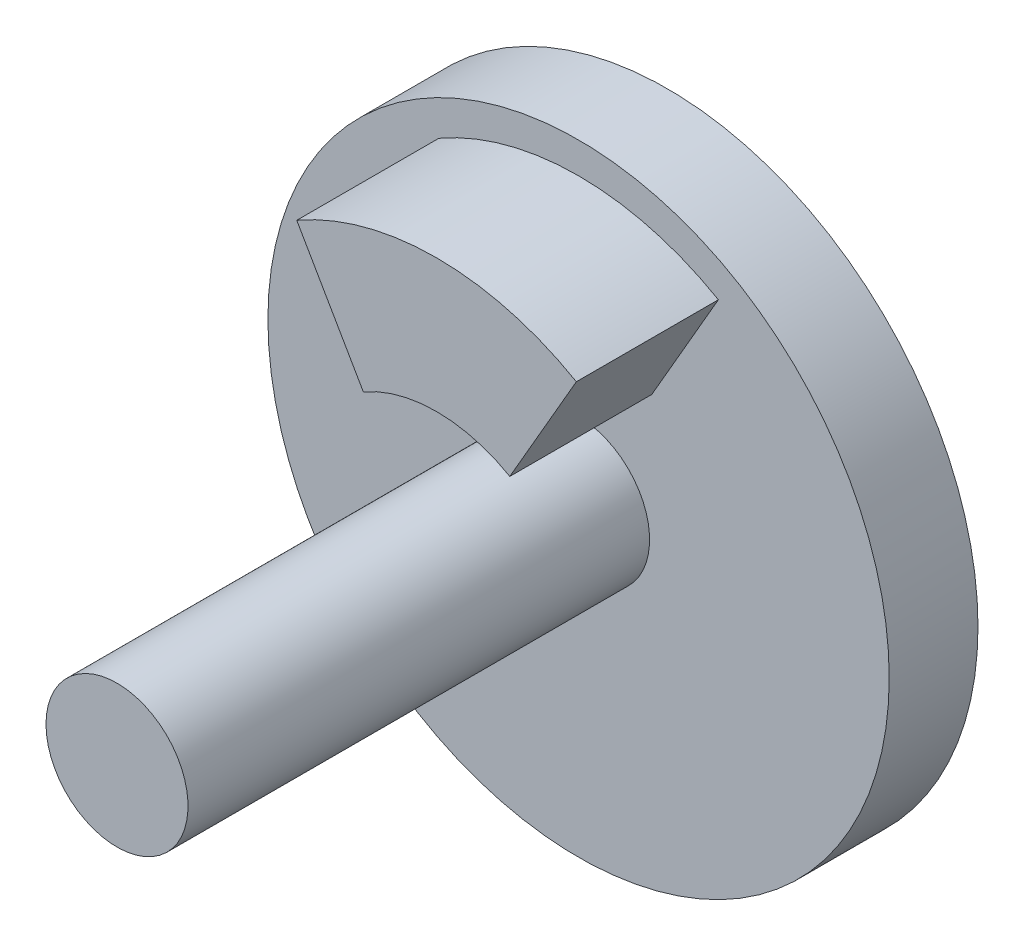
ISO-10303-21;
HEADER;
FILE_DESCRIPTION(('STEP AP214'),'2;1');
FILE_NAME('part.step','',(''),(''),'','','');
FILE_SCHEMA(('AUTOMOTIVE_DESIGN { 1 0 10303 214 1 1 1 1 }'));
ENDSEC;
DATA;
#1=APPLICATION_CONTEXT('core data for automotive mechanical design processes');
#2=APPLICATION_PROTOCOL_DEFINITION('international standard','automotive_design',2000,#1);
#3=PRODUCT_CONTEXT('',#1,'mechanical');
#4=PRODUCT('Part','Part','',(#3));
#5=PRODUCT_RELATED_PRODUCT_CATEGORY('part','',(#4));
#6=PRODUCT_DEFINITION_FORMATION('','',#4);
#7=PRODUCT_DEFINITION_CONTEXT('part definition',#1,'design');
#8=PRODUCT_DEFINITION('design','',#6,#7);
#9=PRODUCT_DEFINITION_SHAPE('','',#8);
#10=(LENGTH_UNIT() NAMED_UNIT(*) SI_UNIT(.MILLI.,.METRE.));
#11=(NAMED_UNIT(*) PLANE_ANGLE_UNIT() SI_UNIT($,.RADIAN.));
#12=(NAMED_UNIT(*) SI_UNIT($,.STERADIAN.) SOLID_ANGLE_UNIT());
#13=UNCERTAINTY_MEASURE_WITH_UNIT(LENGTH_MEASURE(1.E-05),#10,'distance_accuracy_value','');
#14=(GEOMETRIC_REPRESENTATION_CONTEXT(3) GLOBAL_UNCERTAINTY_ASSIGNED_CONTEXT((#13)) GLOBAL_UNIT_ASSIGNED_CONTEXT((#10,
#11,#12)) REPRESENTATION_CONTEXT('',''));
#15=CARTESIAN_POINT('',(0.,0.,0.));
#16=DIRECTION('',(0.,0.,1.));
#17=DIRECTION('',(1.,0.,0.));
#18=AXIS2_PLACEMENT_3D('',#15,#16,#17);
#19=CARTESIAN_POINT('',(0.,0.,2.5));
#20=DIRECTION('',(0.,0.,1.));
#21=DIRECTION('',(1.,0.,0.));
#22=AXIS2_PLACEMENT_3D('',#19,#20,#21);
#23=PLANE('',#22);
#24=CARTESIAN_POINT('',(0.,0.,2.5));
#25=DIRECTION('',(0.,0.,1.));
#26=DIRECTION('',(1.,0.,0.));
#27=AXIS2_PLACEMENT_3D('',#24,#25,#26);
#28=CIRCLE('',#27,4.);
#29=CARTESIAN_POINT('',(-4.,0.,2.5));
#30=VERTEX_POINT('',#29);
#31=EDGE_CURVE('E107',#30,#30,#28,.T.);
#32=ORIENTED_EDGE('',*,*,#31,.F.);
#33=EDGE_LOOP('',(#32));
#34=FACE_BOUND('',#33,.T.);
#35=CARTESIAN_POINT('',(0.,0.,2.5));
#36=DIRECTION('',(0.,0.,1.));
#37=DIRECTION('',(1.,0.,0.));
#38=AXIS2_PLACEMENT_3D('',#35,#36,#37);
#39=CIRCLE('',#38,17.5);
#40=CARTESIAN_POINT('',(17.5,0.,2.5));
#41=VERTEX_POINT('',#40);
#42=EDGE_CURVE('E11',#41,#41,#39,.T.);
#43=ORIENTED_EDGE('',*,*,#42,.T.);
#44=EDGE_LOOP('',(#43));
#45=FACE_BOUND('',#44,.T.);
#46=DIRECTION('',(0.499999999999996,-0.866025403784441,0.));
#47=VECTOR('',#46,1.);
#48=CARTESIAN_POINT('',(-4.12499999999996,7.14470958122165,2.5));
#49=LINE('',#48,#47);
#50=CARTESIAN_POINT('',(-7.87499999999993,13.639900109605,2.5));
#51=VERTEX_POINT('',#50);
#52=CARTESIAN_POINT('',(-4.12499999999996,7.14470958122165,2.5));
#53=VERTEX_POINT('',#52);
#54=EDGE_CURVE('E128',#51,#53,#49,.T.);
#55=ORIENTED_EDGE('',*,*,#54,.F.);
#56=CARTESIAN_POINT('',(0.,0.,2.5));
#57=DIRECTION('',(0.,0.,1.));
#58=DIRECTION('',(-1.,0.,0.));
#59=AXIS2_PLACEMENT_3D('',#56,#57,#58);
#60=CIRCLE('',#59,15.75);
#61=CARTESIAN_POINT('',(7.87499999999993,13.639900109605,2.5));
#62=VERTEX_POINT('',#61);
#63=EDGE_CURVE('E112',#62,#51,#60,.T.);
#64=ORIENTED_EDGE('',*,*,#63,.F.);
#65=DIRECTION('',(0.499999999999995,0.866025403784441,0.));
#66=VECTOR('',#65,1.);
#67=CARTESIAN_POINT('',(7.87499999999993,13.639900109605,2.5));
#68=LINE('',#67,#66);
#69=CARTESIAN_POINT('',(4.12499999999996,7.14470958122164,2.5));
#70=VERTEX_POINT('',#69);
#71=EDGE_CURVE('E119',#70,#62,#68,.T.);
#72=ORIENTED_EDGE('',*,*,#71,.F.);
#73=CARTESIAN_POINT('',(0.,0.,2.5));
#74=DIRECTION('',(0.,0.,-1.));
#75=DIRECTION('',(1.,0.,0.));
#76=AXIS2_PLACEMENT_3D('',#73,#74,#75);
#77=CIRCLE('',#76,8.25);
#78=EDGE_CURVE('E130',#53,#70,#77,.T.);
#79=ORIENTED_EDGE('',*,*,#78,.F.);
#80=EDGE_LOOP('',(#55,#64,#72,#79));
#81=FACE_BOUND('',#80,.T.);
#82=ADVANCED_FACE('F34',(#34,#45,#81),#23,.T.);
#83=CARTESIAN_POINT('',(0.,0.,2.5));
#84=DIRECTION('',(0.,0.,-1.));
#85=DIRECTION('',(-1.,0.,0.));
#86=AXIS2_PLACEMENT_3D('',#83,#84,#85);
#87=CYLINDRICAL_SURFACE('',#86,17.5);
#88=ORIENTED_EDGE('',*,*,#42,.F.);
#89=EDGE_LOOP('',(#88));
#90=FACE_BOUND('',#89,.T.);
#91=CARTESIAN_POINT('',(0.,0.,-2.5));
#92=DIRECTION('',(0.,0.,1.));
#93=DIRECTION('',(1.,0.,0.));
#94=AXIS2_PLACEMENT_3D('',#91,#92,#93);
#95=CIRCLE('',#94,17.5);
#96=CARTESIAN_POINT('',(17.5,0.,-2.5));
#97=VERTEX_POINT('',#96);
#98=EDGE_CURVE('E38',#97,#97,#95,.T.);
#99=ORIENTED_EDGE('',*,*,#98,.T.);
#100=EDGE_LOOP('',(#99));
#101=FACE_BOUND('',#100,.T.);
#102=ADVANCED_FACE('F36',(#90,#101),#87,.T.);
#103=CARTESIAN_POINT('',(0.,0.,-2.5));
#104=DIRECTION('',(0.,0.,1.));
#105=DIRECTION('',(1.,0.,0.));
#106=AXIS2_PLACEMENT_3D('',#103,#104,#105);
#107=PLANE('',#106);
#108=DIRECTION('',(1.,0.,0.));
#109=VECTOR('',#108,1.);
#110=CARTESIAN_POINT('',(2.38513917599978,2.2,-2.5));
#111=LINE('',#110,#109);
#112=CARTESIAN_POINT('',(-2.38513917599978,2.2,-2.5));
#113=VERTEX_POINT('',#112);
#114=CARTESIAN_POINT('',(2.38513917599978,2.2,-2.5));
#115=VERTEX_POINT('',#114);
#116=EDGE_CURVE('E100',#113,#115,#111,.T.);
#117=ORIENTED_EDGE('',*,*,#116,.F.);
#118=CARTESIAN_POINT('',(0.,0.,-2.5));
#119=DIRECTION('',(0.,0.,-1.));
#120=DIRECTION('',(-1.,0.,0.));
#121=AXIS2_PLACEMENT_3D('',#118,#119,#120);
#122=CIRCLE('',#121,3.24482493963679);
#123=EDGE_CURVE('E49',#115,#113,#122,.T.);
#124=ORIENTED_EDGE('',*,*,#123,.F.);
#125=EDGE_LOOP('',(#117,#124));
#126=FACE_BOUND('',#125,.T.);
#127=ORIENTED_EDGE('',*,*,#98,.F.);
#128=EDGE_LOOP('',(#127));
#129=FACE_BOUND('',#128,.T.);
#130=ADVANCED_FACE('F146',(#126,#129),#107,.F.);
#131=CARTESIAN_POINT('',(0.,0.,10.5));
#132=DIRECTION('',(0.,0.,-1.));
#133=DIRECTION('',(-1.,0.,0.));
#134=AXIS2_PLACEMENT_3D('',#131,#132,#133);
#135=CYLINDRICAL_SURFACE('',#134,15.75);
#136=ORIENTED_EDGE('',*,*,#63,.T.);
#137=DIRECTION('',(0.,0.,-1.));
#138=VECTOR('',#137,1.);
#139=CARTESIAN_POINT('',(-7.87499999999993,13.639900109605,10.5));
#140=LINE('',#139,#138);
#141=CARTESIAN_POINT('',(-7.87499999999993,13.639900109605,10.5));
#142=VERTEX_POINT('',#141);
#143=EDGE_CURVE('E139',#142,#51,#140,.T.);
#144=ORIENTED_EDGE('',*,*,#143,.F.);
#145=CARTESIAN_POINT('',(0.,0.,10.5));
#146=DIRECTION('',(0.,0.,1.));
#147=DIRECTION('',(-1.,0.,0.));
#148=AXIS2_PLACEMENT_3D('',#145,#146,#147);
#149=CIRCLE('',#148,15.75);
#150=CARTESIAN_POINT('',(7.87499999999993,13.639900109605,10.5));
#151=VERTEX_POINT('',#150);
#152=EDGE_CURVE('E115',#151,#142,#149,.T.);
#153=ORIENTED_EDGE('',*,*,#152,.F.);
#154=DIRECTION('',(0.,0.,-1.));
#155=VECTOR('',#154,1.);
#156=CARTESIAN_POINT('',(7.87499999999993,13.639900109605,10.5));
#157=LINE('',#156,#155);
#158=EDGE_CURVE('E125',#151,#62,#157,.T.);
#159=ORIENTED_EDGE('',*,*,#158,.T.);
#160=EDGE_LOOP('',(#136,#144,#153,#159));
#161=FACE_BOUND('',#160,.T.);
#162=ADVANCED_FACE('F148',(#161),#135,.T.);
#163=CARTESIAN_POINT('',(-4.12499999999996,7.14470958122165,10.5));
#164=DIRECTION('',(0.866025403784441,0.499999999999996,0.));
#165=DIRECTION('',(-0.499999999999996,0.866025403784441,0.));
#166=AXIS2_PLACEMENT_3D('',#163,#164,#165);
#167=PLANE('',#166);
#168=ORIENTED_EDGE('',*,*,#54,.T.);
#169=DIRECTION('',(0.,0.,-1.));
#170=VECTOR('',#169,1.);
#171=CARTESIAN_POINT('',(-4.12499999999996,7.14470958122165,10.5));
#172=LINE('',#171,#170);
#173=CARTESIAN_POINT('',(-4.12499999999996,7.14470958122165,10.5));
#174=VERTEX_POINT('',#173);
#175=EDGE_CURVE('E136',#174,#53,#172,.T.);
#176=ORIENTED_EDGE('',*,*,#175,.F.);
#177=DIRECTION('',(0.499999999999996,-0.866025403784441,0.));
#178=VECTOR('',#177,1.);
#179=CARTESIAN_POINT('',(-4.12499999999996,7.14470958122165,10.5));
#180=LINE('',#179,#178);
#181=EDGE_CURVE('E118',#142,#174,#180,.T.);
#182=ORIENTED_EDGE('',*,*,#181,.F.);
#183=ORIENTED_EDGE('',*,*,#143,.T.);
#184=EDGE_LOOP('',(#168,#176,#182,#183));
#185=FACE_BOUND('',#184,.T.);
#186=ADVANCED_FACE('F154',(#185),#167,.F.);
#187=CARTESIAN_POINT('',(0.,0.,10.5));
#188=DIRECTION('',(0.,0.,-1.));
#189=DIRECTION('',(-1.,0.,0.));
#190=AXIS2_PLACEMENT_3D('',#187,#188,#189);
#191=CYLINDRICAL_SURFACE('',#190,8.25);
#192=ORIENTED_EDGE('',*,*,#78,.T.);
#193=DIRECTION('',(0.,0.,-1.));
#194=VECTOR('',#193,1.);
#195=CARTESIAN_POINT('',(4.12499999999996,7.14470958122164,10.5));
#196=LINE('',#195,#194);
#197=CARTESIAN_POINT('',(4.12499999999996,7.14470958122164,10.5));
#198=VERTEX_POINT('',#197);
#199=EDGE_CURVE('E57',#198,#70,#196,.T.);
#200=ORIENTED_EDGE('',*,*,#199,.F.);
#201=CARTESIAN_POINT('',(0.,0.,10.5));
#202=DIRECTION('',(0.,0.,-1.));
#203=DIRECTION('',(1.,0.,0.));
#204=AXIS2_PLACEMENT_3D('',#201,#202,#203);
#205=CIRCLE('',#204,8.25);
#206=EDGE_CURVE('E121',#174,#198,#205,.T.);
#207=ORIENTED_EDGE('',*,*,#206,.F.);
#208=ORIENTED_EDGE('',*,*,#175,.T.);
#209=EDGE_LOOP('',(#192,#200,#207,#208));
#210=FACE_BOUND('',#209,.T.);
#211=ADVANCED_FACE('F168',(#210),#191,.F.);
#212=CARTESIAN_POINT('',(7.87499999999993,13.639900109605,10.5));
#213=DIRECTION('',(-0.866025403784441,0.499999999999995,0.));
#214=DIRECTION('',(-0.499999999999995,-0.866025403784441,0.));
#215=AXIS2_PLACEMENT_3D('',#212,#213,#214);
#216=PLANE('',#215);
#217=ORIENTED_EDGE('',*,*,#71,.T.);
#218=ORIENTED_EDGE('',*,*,#158,.F.);
#219=DIRECTION('',(0.499999999999995,0.866025403784441,0.));
#220=VECTOR('',#219,1.);
#221=CARTESIAN_POINT('',(7.87499999999993,13.639900109605,10.5));
#222=LINE('',#221,#220);
#223=EDGE_CURVE('E123',#198,#151,#222,.T.);
#224=ORIENTED_EDGE('',*,*,#223,.F.);
#225=ORIENTED_EDGE('',*,*,#199,.T.);
#226=EDGE_LOOP('',(#217,#218,#224,#225));
#227=FACE_BOUND('',#226,.T.);
#228=ADVANCED_FACE('F171',(#227),#216,.F.);
#229=CARTESIAN_POINT('',(0.,0.,10.5));
#230=DIRECTION('',(0.,0.,-1.));
#231=DIRECTION('',(-1.,0.,0.));
#232=AXIS2_PLACEMENT_3D('',#229,#230,#231);
#233=PLANE('',#232);
#234=ORIENTED_EDGE('',*,*,#152,.T.);
#235=ORIENTED_EDGE('',*,*,#181,.T.);
#236=ORIENTED_EDGE('',*,*,#206,.T.);
#237=ORIENTED_EDGE('',*,*,#223,.T.);
#238=EDGE_LOOP('',(#234,#235,#236,#237));
#239=FACE_BOUND('',#238,.T.);
#240=ADVANCED_FACE('F175',(#239),#233,.F.);
#241=CARTESIAN_POINT('',(0.,0.,28.5));
#242=DIRECTION('',(0.,0.,-1.));
#243=DIRECTION('',(-1.,0.,0.));
#244=AXIS2_PLACEMENT_3D('',#241,#242,#243);
#245=CYLINDRICAL_SURFACE('',#244,4.);
#246=CARTESIAN_POINT('',(0.,0.,28.5));
#247=DIRECTION('',(0.,0.,1.));
#248=DIRECTION('',(1.,0.,0.));
#249=AXIS2_PLACEMENT_3D('',#246,#247,#248);
#250=CIRCLE('',#249,4.);
#251=CARTESIAN_POINT('',(-4.,0.,28.5));
#252=VERTEX_POINT('',#251);
#253=EDGE_CURVE('E109',#252,#252,#250,.T.);
#254=CARTESIAN_POINT('',(-4.,0.,28.5));
#255=CARTESIAN_POINT('',(-4.,0.,28.2291666666667));
#256=CARTESIAN_POINT('',(-4.,0.,27.9583333333333));
#257=CARTESIAN_POINT('',(-4.,0.,27.4166666666667));
#258=CARTESIAN_POINT('',(-4.,0.,27.1458333333333));
#259=CARTESIAN_POINT('',(-4.,0.,26.6041666666667));
#260=CARTESIAN_POINT('',(-4.,0.,26.3333333333333));
#261=CARTESIAN_POINT('',(-4.,0.,25.7916666666667));
#262=CARTESIAN_POINT('',(-4.,0.,25.5208333333333));
#263=CARTESIAN_POINT('',(-4.,0.,24.9791666666667));
#264=CARTESIAN_POINT('',(-4.,0.,24.7083333333333));
#265=CARTESIAN_POINT('',(-4.,0.,24.1666666666667));
#266=CARTESIAN_POINT('',(-4.,0.,23.8958333333333));
#267=CARTESIAN_POINT('',(-4.,0.,23.3541666666667));
#268=CARTESIAN_POINT('',(-4.,0.,23.0833333333333));
#269=CARTESIAN_POINT('',(-4.,0.,22.5416666666667));
#270=CARTESIAN_POINT('',(-4.,0.,22.2708333333333));
#271=CARTESIAN_POINT('',(-4.,0.,21.7291666666667));
#272=CARTESIAN_POINT('',(-4.,0.,21.4583333333333));
#273=CARTESIAN_POINT('',(-4.,0.,20.9166666666667));
#274=CARTESIAN_POINT('',(-4.,0.,20.6458333333333));
#275=CARTESIAN_POINT('',(-4.,0.,20.1041666666667));
#276=CARTESIAN_POINT('',(-4.,0.,19.8333333333333));
#277=CARTESIAN_POINT('',(-4.,0.,19.2916666666667));
#278=CARTESIAN_POINT('',(-4.,0.,19.0208333333333));
#279=CARTESIAN_POINT('',(-4.,0.,18.4791666666667));
#280=CARTESIAN_POINT('',(-4.,0.,18.2083333333333));
#281=CARTESIAN_POINT('',(-4.,0.,17.6666666666667));
#282=CARTESIAN_POINT('',(-4.,0.,17.3958333333333));
#283=CARTESIAN_POINT('',(-4.,0.,16.8541666666667));
#284=CARTESIAN_POINT('',(-4.,0.,16.5833333333333));
#285=CARTESIAN_POINT('',(-4.,0.,16.0416666666667));
#286=CARTESIAN_POINT('',(-4.,0.,15.7708333333333));
#287=CARTESIAN_POINT('',(-4.,0.,15.2291666666667));
#288=CARTESIAN_POINT('',(-4.,0.,14.9583333333333));
#289=CARTESIAN_POINT('',(-4.,0.,14.4166666666667));
#290=CARTESIAN_POINT('',(-4.,0.,14.1458333333333));
#291=CARTESIAN_POINT('',(-4.,0.,13.6041666666667));
#292=CARTESIAN_POINT('',(-4.,0.,13.3333333333333));
#293=CARTESIAN_POINT('',(-4.,0.,12.7916666666667));
#294=CARTESIAN_POINT('',(-4.,0.,12.5208333333333));
#295=CARTESIAN_POINT('',(-4.,0.,11.9791666666667));
#296=CARTESIAN_POINT('',(-4.,0.,11.7083333333333));
#297=CARTESIAN_POINT('',(-4.,0.,11.1666666666667));
#298=CARTESIAN_POINT('',(-4.,0.,10.8958333333333));
#299=CARTESIAN_POINT('',(-4.,0.,10.3541666666667));
#300=CARTESIAN_POINT('',(-4.,0.,10.0833333333333));
#301=CARTESIAN_POINT('',(-4.,0.,9.54166666666667));
#302=CARTESIAN_POINT('',(-4.,0.,9.27083333333333));
#303=CARTESIAN_POINT('',(-4.,0.,8.72916666666666));
#304=CARTESIAN_POINT('',(-4.,0.,8.45833333333333));
#305=CARTESIAN_POINT('',(-4.,0.,7.91666666666667));
#306=CARTESIAN_POINT('',(-4.,0.,7.64583333333333));
#307=CARTESIAN_POINT('',(-4.,0.,7.10416666666667));
#308=CARTESIAN_POINT('',(-4.,0.,6.83333333333333));
#309=CARTESIAN_POINT('',(-4.,0.,6.29166666666667));
#310=CARTESIAN_POINT('',(-4.,0.,6.02083333333333));
#311=CARTESIAN_POINT('',(-4.,0.,5.47916666666666));
#312=CARTESIAN_POINT('',(-4.,0.,5.20833333333333));
#313=CARTESIAN_POINT('',(-4.,0.,4.66666666666667));
#314=CARTESIAN_POINT('',(-4.,0.,4.39583333333333));
#315=CARTESIAN_POINT('',(-4.,0.,3.85416666666667));
#316=CARTESIAN_POINT('',(-4.,0.,3.58333333333333));
#317=CARTESIAN_POINT('',(-4.,0.,3.04166666666667));
#318=CARTESIAN_POINT('',(-4.,0.,2.77083333333333));
#319=CARTESIAN_POINT('',(-4.,0.,2.5));
#320=B_SPLINE_CURVE_WITH_KNOTS('',3,(#254,#255,#256,#257,#258,#259,#260,#261,#262,#263,#264,
#265,#266,#267,#268,#269,#270,#271,#272,#273,#274,#275,#276,#277,#278,#279,#280,#281,#282,#283,
#284,#285,#286,#287,#288,#289,#290,#291,#292,#293,#294,#295,#296,#297,#298,#299,#300,#301,#302,
#303,#304,#305,#306,#307,#308,#309,#310,#311,#312,#313,#314,#315,#316,#317,#318,#319),
.UNSPECIFIED.,.F.,.F.,(4,2,2,2,2,2,2,2,2,2,2,2,2,2,2,2,2,2,2,2,2,2,2,2,2,2,2,2,2,2,2,2,4),(0.,
0.812500000000001,1.625,2.4375,3.25,4.0625,4.875,5.6875,6.5,7.3125,8.125,8.9375,9.75,10.5625,
11.375,12.1875,13.,13.8125,14.625,15.4375,16.25,17.0625,17.875,18.6875,19.5,20.3125,21.125,
21.9375,22.75,23.5625,24.375,25.1875,26.),.UNSPECIFIED.);
#321=EDGE_CURVE('BSEAM178',#252,#30,#320,.T.);
#322=ORIENTED_EDGE('',*,*,#253,.F.);
#323=ORIENTED_EDGE('',*,*,#31,.T.);
#324=ORIENTED_EDGE('',*,*,#321,.T.);
#325=ORIENTED_EDGE('',*,*,#321,.F.);
#326=EDGE_LOOP('',(#322,#324,#323,#325));
#327=FACE_BOUND('',#326,.T.);
#328=ADVANCED_FACE('F178',(#327),#245,.T.);
#329=CARTESIAN_POINT('',(0.,0.,28.5));
#330=DIRECTION('',(0.,0.,1.));
#331=DIRECTION('',(1.,0.,0.));
#332=AXIS2_PLACEMENT_3D('',#329,#330,#331);
#333=PLANE('',#332);
#334=ORIENTED_EDGE('',*,*,#253,.T.);
#335=EDGE_LOOP('',(#334));
#336=FACE_BOUND('',#335,.T.);
#337=ADVANCED_FACE('F182',(#336),#333,.T.);
#338=CARTESIAN_POINT('',(0.,0.,7.5));
#339=DIRECTION('',(0.,0.,-1.));
#340=DIRECTION('',(-1.,0.,0.));
#341=AXIS2_PLACEMENT_3D('',#338,#339,#340);
#342=CYLINDRICAL_SURFACE('',#341,3.24482493963679);
#343=ORIENTED_EDGE('',*,*,#123,.T.);
#344=DIRECTION('',(0.,0.,-1.));
#345=VECTOR('',#344,1.);
#346=CARTESIAN_POINT('',(-2.38513917599978,2.2,7.5));
#347=LINE('',#346,#345);
#348=CARTESIAN_POINT('',(-2.38513917599978,2.2,7.5));
#349=VERTEX_POINT('',#348);
#350=EDGE_CURVE('E86',#349,#113,#347,.T.);
#351=ORIENTED_EDGE('',*,*,#350,.F.);
#352=CARTESIAN_POINT('',(0.,0.,7.5));
#353=DIRECTION('',(0.,0.,-1.));
#354=DIRECTION('',(-1.,0.,0.));
#355=AXIS2_PLACEMENT_3D('',#352,#353,#354);
#356=CIRCLE('',#355,3.24482493963679);
#357=CARTESIAN_POINT('',(2.38513917599978,2.2,7.5));
#358=VERTEX_POINT('',#357);
#359=EDGE_CURVE('E89',#358,#349,#356,.T.);
#360=ORIENTED_EDGE('',*,*,#359,.F.);
#361=DIRECTION('',(0.,0.,-1.));
#362=VECTOR('',#361,1.);
#363=CARTESIAN_POINT('',(2.38513917599978,2.2,7.5));
#364=LINE('',#363,#362);
#365=EDGE_CURVE('E95',#358,#115,#364,.T.);
#366=ORIENTED_EDGE('',*,*,#365,.T.);
#367=EDGE_LOOP('',(#343,#351,#360,#366));
#368=FACE_BOUND('',#367,.T.);
#369=ADVANCED_FACE('F88',(#368),#342,.F.);
#370=CARTESIAN_POINT('',(2.38513917599978,2.2,7.5));
#371=DIRECTION('',(0.,1.,0.));
#372=DIRECTION('',(0.,0.,1.));
#373=AXIS2_PLACEMENT_3D('',#370,#371,#372);
#374=PLANE('',#373);
#375=ORIENTED_EDGE('',*,*,#116,.T.);
#376=ORIENTED_EDGE('',*,*,#365,.F.);
#377=DIRECTION('',(1.,0.,0.));
#378=VECTOR('',#377,1.);
#379=CARTESIAN_POINT('',(2.38513917599978,2.2,7.5));
#380=LINE('',#379,#378);
#381=EDGE_CURVE('E96',#349,#358,#380,.T.);
#382=ORIENTED_EDGE('',*,*,#381,.F.);
#383=ORIENTED_EDGE('',*,*,#350,.T.);
#384=EDGE_LOOP('',(#375,#376,#382,#383));
#385=FACE_BOUND('',#384,.T.);
#386=ADVANCED_FACE('F102',(#385),#374,.F.);
#387=CARTESIAN_POINT('',(0.,0.,7.5));
#388=DIRECTION('',(0.,0.,-1.));
#389=DIRECTION('',(-1.,0.,0.));
#390=AXIS2_PLACEMENT_3D('',#387,#388,#389);
#391=PLANE('',#390);
#392=ORIENTED_EDGE('',*,*,#359,.T.);
#393=ORIENTED_EDGE('',*,*,#381,.T.);
#394=EDGE_LOOP('',(#392,#393));
#395=FACE_BOUND('',#394,.T.);
#396=ADVANCED_FACE('F99',(#395),#391,.T.);
#397=CLOSED_SHELL('',(#82,#102,#130,#162,#186,#211,#228,#240,#328,#337,#369,#386,#396));
#398=MANIFOLD_SOLID_BREP('B2',#397);
#399=ADVANCED_BREP_SHAPE_REPRESENTATION('',(#18,#398),#14);
#400=SHAPE_DEFINITION_REPRESENTATION(#9,#399);
ENDSEC;
END-ISO-10303-21;
